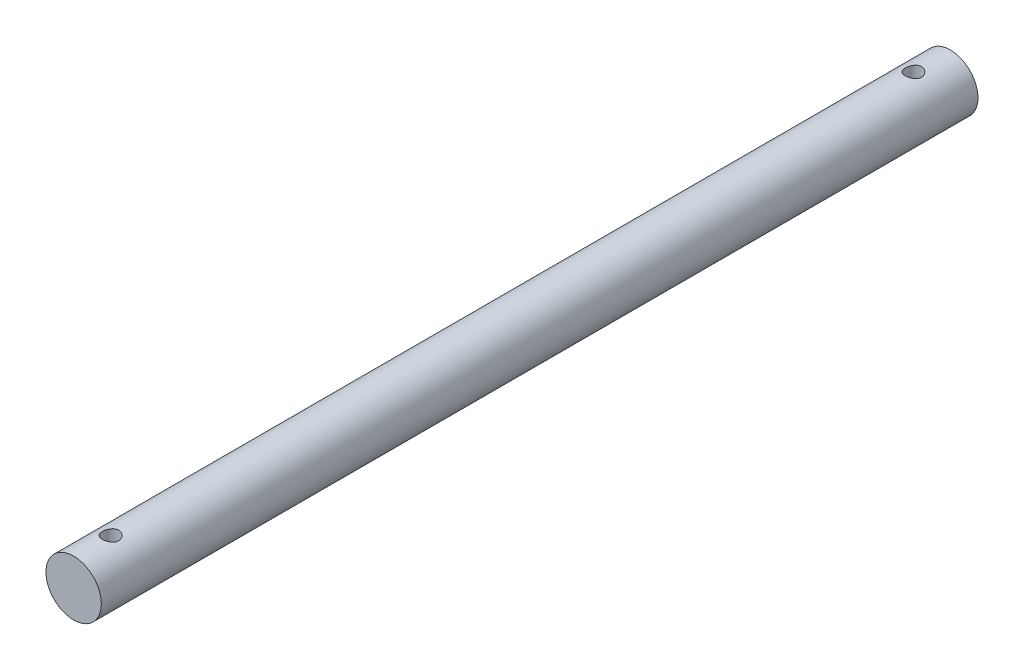
ISO-10303-21;
HEADER;
FILE_DESCRIPTION(('STEP AP214'),'2;1');
FILE_NAME('part.step','',(''),(''),'','','');
FILE_SCHEMA(('AUTOMOTIVE_DESIGN { 1 0 10303 214 1 1 1 1 }'));
ENDSEC;
DATA;
#1=APPLICATION_CONTEXT('core data for automotive mechanical design processes');
#2=APPLICATION_PROTOCOL_DEFINITION('international standard','automotive_design',2000,#1);
#3=PRODUCT_CONTEXT('',#1,'mechanical');
#4=PRODUCT('Part','Part','',(#3));
#5=PRODUCT_RELATED_PRODUCT_CATEGORY('part','',(#4));
#6=PRODUCT_DEFINITION_FORMATION('','',#4);
#7=PRODUCT_DEFINITION_CONTEXT('part definition',#1,'design');
#8=PRODUCT_DEFINITION('design','',#6,#7);
#9=PRODUCT_DEFINITION_SHAPE('','',#8);
#10=(LENGTH_UNIT() NAMED_UNIT(*) SI_UNIT(.MILLI.,.METRE.));
#11=(NAMED_UNIT(*) PLANE_ANGLE_UNIT() SI_UNIT($,.RADIAN.));
#12=(NAMED_UNIT(*) SI_UNIT($,.STERADIAN.) SOLID_ANGLE_UNIT());
#13=UNCERTAINTY_MEASURE_WITH_UNIT(LENGTH_MEASURE(1.E-05),#10,'distance_accuracy_value','');
#14=(GEOMETRIC_REPRESENTATION_CONTEXT(3) GLOBAL_UNCERTAINTY_ASSIGNED_CONTEXT((#13)) GLOBAL_UNIT_ASSIGNED_CONTEXT((#10,
#11,#12)) REPRESENTATION_CONTEXT('',''));
#15=CARTESIAN_POINT('',(0.,0.,0.));
#16=DIRECTION('',(0.,0.,1.));
#17=DIRECTION('',(1.,0.,0.));
#18=AXIS2_PLACEMENT_3D('',#15,#16,#17);
#19=CARTESIAN_POINT('',(0.,0.,190.));
#20=DIRECTION('',(0.,0.,-1.));
#21=DIRECTION('',(-1.,0.,0.));
#22=AXIS2_PLACEMENT_3D('',#19,#20,#21);
#23=CYLINDRICAL_SURFACE('',#22,6.);
#24=CARTESIAN_POINT('',(0.,-6.,9.75));
#25=CARTESIAN_POINT('',(0.0961253080181355,-5.99999897932778,9.74999851514796));
#26=CARTESIAN_POINT('',(0.192265738977876,-5.99766772555916,9.74205359001831));
#27=CARTESIAN_POINT('',(0.381754666118446,-5.9885952693758,9.71055420393173));
#28=CARTESIAN_POINT('',(0.475102186570465,-5.98185254415878,9.68699435279911));
#29=CARTESIAN_POINT('',(0.656244329270384,-5.96469737869574,9.62511299381745));
#30=CARTESIAN_POINT('',(0.744046672462425,-5.95429017982355,9.58681256248942));
#31=CARTESIAN_POINT('',(0.911982923632397,-5.93089244308038,9.49662155840011));
#32=CARTESIAN_POINT('',(0.992115936834367,-5.91790160432062,9.44472940253345));
#33=CARTESIAN_POINT('',(1.14462561886912,-5.89033024399658,9.32733498418698));
#34=CARTESIAN_POINT('',(1.21676335643119,-5.87571850769828,9.26152966416691));
#35=CARTESIAN_POINT('',(1.34915166645238,-5.84674198910841,9.11882327100677));
#36=CARTESIAN_POINT('',(1.40940036887666,-5.83237724599043,9.0419204556219));
#37=CARTESIAN_POINT('',(1.51753336674037,-5.80519383512121,8.87721033286065));
#38=CARTESIAN_POINT('',(1.56513041604445,-5.79241411758615,8.78920741823369));
#39=CARTESIAN_POINT('',(1.64475391362963,-5.7703123169837,8.60601392359827));
#40=CARTESIAN_POINT('',(1.67678387060038,-5.76098945488303,8.51082496885516));
#41=CARTESIAN_POINT('',(1.72351063083406,-5.74718144308774,8.31863537029766));
#42=CARTESIAN_POINT('',(1.73864609017391,-5.74257413524905,8.22175038253513));
#43=CARTESIAN_POINT('',(1.75252346344242,-5.73835505823415,8.0267152085859));
#44=CARTESIAN_POINT('',(1.75126910635539,-5.73874215273942,7.92856531526511));
#45=CARTESIAN_POINT('',(1.73274795276527,-5.74435959682319,7.73731524540825));
#46=CARTESIAN_POINT('',(1.71602568393069,-5.74942523520474,7.64415670470324));
#47=CARTESIAN_POINT('',(1.66792117497863,-5.76356324195848,7.46202918903925));
#48=CARTESIAN_POINT('',(1.63653755962284,-5.77263598619395,7.37306060796158));
#49=CARTESIAN_POINT('',(1.55958925270797,-5.79390080921967,7.20048400801911));
#50=CARTESIAN_POINT('',(1.51384428393233,-5.80613217077637,7.116961417586));
#51=CARTESIAN_POINT('',(1.40959719774949,-5.83231660479806,6.95859323240331));
#52=CARTESIAN_POINT('',(1.35109213587038,-5.84627007432716,6.8837496465045));
#53=CARTESIAN_POINT('',(1.22026040657199,-5.87499914138168,6.74176939696963));
#54=CARTESIAN_POINT('',(1.14748039837389,-5.88978548224527,6.67505196568478));
#55=CARTESIAN_POINT('',(0.9915813088856,-5.91802612754819,6.55467457984276));
#56=CARTESIAN_POINT('',(0.908461646345306,-5.93148035702561,6.50101535986281));
#57=CARTESIAN_POINT('',(0.733510271908772,-5.955652534232,6.40804165565273));
#58=CARTESIAN_POINT('',(0.641629012196374,-5.96635347926388,6.36881569218869));
#59=CARTESIAN_POINT('',(0.452189927913561,-5.98369087780733,6.30649482914881));
#60=CARTESIAN_POINT('',(0.354633604003034,-5.99032840050988,6.28339568596673));
#61=CARTESIAN_POINT('',(0.160181198028379,-5.99862388766847,6.25467172956898));
#62=CARTESIAN_POINT('',(0.0633758944645877,-6.00044382600874,6.24847829102018));
#63=CARTESIAN_POINT('',(-0.129894955210873,-5.99937180655025,6.25215387818972));
#64=CARTESIAN_POINT('',(-0.226360542441065,-5.99648044012062,6.26202088797948));
#65=CARTESIAN_POINT('',(-0.414097830664113,-5.98641640064662,6.29707558682437));
#66=CARTESIAN_POINT('',(-0.505436223327998,-5.97933553979801,6.32193493989793));
#67=CARTESIAN_POINT('',(-0.682629103921201,-5.96170716095043,6.38587721933104));
#68=CARTESIAN_POINT('',(-0.768482945307058,-5.95115923513568,6.42496181900248));
#69=CARTESIAN_POINT('',(-0.934392573124852,-5.92740206937566,6.51722533792297));
#70=CARTESIAN_POINT('',(-1.01427661269997,-5.91413878305625,6.57069881094937));
#71=CARTESIAN_POINT('',(-1.16413296084878,-5.8864769523799,6.68986114921517));
#72=CARTESIAN_POINT('',(-1.23410291257553,-5.87207813933966,6.75555291051717));
#73=CARTESIAN_POINT('',(-1.36462158583737,-5.84315282434342,6.89995535038969));
#74=CARTESIAN_POINT('',(-1.424766422283,-5.82863878716344,6.97903434380823));
#75=CARTESIAN_POINT('',(-1.5309555158763,-5.80165389300297,7.14647697273483));
#76=CARTESIAN_POINT('',(-1.57700021873977,-5.78918297144387,7.23484031463907));
#77=CARTESIAN_POINT('',(-1.65335355571835,-5.76784149110914,7.41800906834096));
#78=CARTESIAN_POINT('',(-1.68374186549711,-5.75895275395434,7.51277902915982));
#79=CARTESIAN_POINT('',(-1.72804822085091,-5.74581531845761,7.70639550313222));
#80=CARTESIAN_POINT('',(-1.74197152209896,-5.7415651395094,7.80524070502689));
#81=CARTESIAN_POINT('',(-1.75260895170656,-5.73832630544296,8.0000225411818));
#82=CARTESIAN_POINT('',(-1.74997891215048,-5.73913712613566,8.09592050986434));
#83=CARTESIAN_POINT('',(-1.72913831847244,-5.74545008197209,8.28584289285404));
#84=CARTESIAN_POINT('',(-1.7109283259395,-5.75095204802057,8.37986737456719));
#85=CARTESIAN_POINT('',(-1.65985748033916,-5.76589662443703,8.56236618301317));
#86=CARTESIAN_POINT('',(-1.62716125079618,-5.77529488178541,8.6508904754052));
#87=CARTESIAN_POINT('',(-1.54817363617336,-5.79696714255006,8.82126724612185));
#88=CARTESIAN_POINT('',(-1.50187976224371,-5.80924167234268,8.9031184995373));
#89=CARTESIAN_POINT('',(-1.39513128146528,-5.83581435741765,9.06089207023767));
#90=CARTESIAN_POINT('',(-1.33424162455882,-5.85016789019055,9.13651071754182));
#91=CARTESIAN_POINT('',(-1.20082452655383,-5.87900256664697,9.27666967580499));
#92=CARTESIAN_POINT('',(-1.12829412203371,-5.89348374193531,9.34120715711446));
#93=CARTESIAN_POINT('',(-0.971285174602811,-5.92141239923087,9.45910953147708));
#94=CARTESIAN_POINT('',(-0.886536063614253,-5.93482122382387,9.51212417615002));
#95=CARTESIAN_POINT('',(-0.708936452074231,-5.95864200095583,9.60307524955485));
#96=CARTESIAN_POINT('',(-0.61609014933606,-5.96905549446415,9.64101943523146));
#97=CARTESIAN_POINT('',(-0.436605177870392,-5.98468728404806,9.69694094930792));
#98=CARTESIAN_POINT('',(-0.35058619705069,-5.99038360588642,9.71678627055829));
#99=CARTESIAN_POINT('',(-0.176382174555847,-5.99804015775584,9.74331551061332));
#100=CARTESIAN_POINT('',(-0.0881974529296947,-6.00000093649312,9.7500013623901));
#101=CARTESIAN_POINT('',(0.,-6.,9.75));
#102=B_SPLINE_CURVE_WITH_KNOTS('',3,(#24,#25,#26,#27,#28,#29,#30,#31,#32,#33,#34,#35,#36,#37,
#38,#39,#40,#41,#42,#43,#44,#45,#46,#47,#48,#49,#50,#51,#52,#53,#54,#55,#56,#57,#58,#59,#60,#61,
#62,#63,#64,#65,#66,#67,#68,#69,#70,#71,#72,#73,#74,#75,#76,#77,#78,#79,#80,#81,#82,#83,#84,#85,
#86,#87,#88,#89,#90,#91,#92,#93,#94,#95,#96,#97,#98,#99,#100,#101),.UNSPECIFIED.,.T.,.F.,(4,2,2,
2,2,2,2,2,2,2,2,2,2,2,2,2,2,2,2,2,2,2,2,2,2,2,2,2,2,2,2,2,2,2,2,2,2,2,4),(0.,0.288052093618849,
0.576203672859808,0.863944765925738,1.15171938874705,1.4465642107671,1.74145537223885,
2.04255951405361,2.34359575805744,2.63661948180926,2.92957653844227,3.21259753810652,
3.49564509054993,3.78239825352144,4.06921765673404,4.36732499534254,4.6654490998204,
4.96537230276013,5.26521655422946,5.55484346037066,5.84443401496554,6.12790175562713,
6.41140285130437,6.70121883369904,6.99110359801335,7.29089914342066,7.59068521108749,
7.88893020644378,8.18707997551211,8.4734936601924,8.75989702134952,9.04312596000905,
9.32640677192025,9.61950228446207,9.9126725299444,10.2137891731667,10.5147506265853,
10.779084693066,11.0433799290662),.UNSPECIFIED.);
#103=CARTESIAN_POINT('',(0.,-6.,9.75));
#104=VERTEX_POINT('',#103);
#105=EDGE_CURVE('E10',#104,#104,#102,.T.);
#106=ORIENTED_EDGE('',*,*,#105,.T.);
#107=EDGE_LOOP('',(#106));
#108=FACE_BOUND('',#107,.T.);
#109=CARTESIAN_POINT('',(0.,6.,9.75));
#110=CARTESIAN_POINT('',(-0.0961253080181355,5.99999897932778,9.74999851514796));
#111=CARTESIAN_POINT('',(-0.192265738977876,5.99766772555916,9.74205359001831));
#112=CARTESIAN_POINT('',(-0.381754666118446,5.9885952693758,9.71055420393173));
#113=CARTESIAN_POINT('',(-0.475102186570466,5.98185254415878,9.68699435279911));
#114=CARTESIAN_POINT('',(-0.656244329270384,5.96469737869574,9.62511299381745));
#115=CARTESIAN_POINT('',(-0.744046672462426,5.95429017982355,9.58681256248942));
#116=CARTESIAN_POINT('',(-0.911982923632398,5.93089244308038,9.49662155840011));
#117=CARTESIAN_POINT('',(-0.992115936834368,5.91790160432062,9.44472940253345));
#118=CARTESIAN_POINT('',(-1.14462561886912,5.89033024399658,9.32733498418698));
#119=CARTESIAN_POINT('',(-1.21676335643119,5.87571850769828,9.26152966416691));
#120=CARTESIAN_POINT('',(-1.34915166645238,5.84674198910841,9.11882327100677));
#121=CARTESIAN_POINT('',(-1.40940036887666,5.83237724599043,9.0419204556219));
#122=CARTESIAN_POINT('',(-1.51753336674038,5.80519383512121,8.87721033286065));
#123=CARTESIAN_POINT('',(-1.56513041604445,5.79241411758615,8.78920741823369));
#124=CARTESIAN_POINT('',(-1.64475391362963,5.7703123169837,8.60601392359827));
#125=CARTESIAN_POINT('',(-1.67678387060038,5.76098945488303,8.51082496885516));
#126=CARTESIAN_POINT('',(-1.72351063083406,5.74718144308774,8.31863537029766));
#127=CARTESIAN_POINT('',(-1.73864609017391,5.74257413524905,8.22175038253513));
#128=CARTESIAN_POINT('',(-1.75252346344242,5.73835505823415,8.0267152085859));
#129=CARTESIAN_POINT('',(-1.75126910635539,5.73874215273942,7.92856531526511));
#130=CARTESIAN_POINT('',(-1.73274795276527,5.74435959682319,7.73731524540825));
#131=CARTESIAN_POINT('',(-1.71602568393069,5.74942523520474,7.64415670470324));
#132=CARTESIAN_POINT('',(-1.66792117497863,5.76356324195848,7.46202918903925));
#133=CARTESIAN_POINT('',(-1.63653755962284,5.77263598619395,7.37306060796158));
#134=CARTESIAN_POINT('',(-1.55958925270797,5.79390080921967,7.20048400801911));
#135=CARTESIAN_POINT('',(-1.51384428393233,5.80613217077637,7.116961417586));
#136=CARTESIAN_POINT('',(-1.40959719774949,5.83231660479806,6.95859323240331));
#137=CARTESIAN_POINT('',(-1.35109213587038,5.84627007432716,6.8837496465045));
#138=CARTESIAN_POINT('',(-1.22026040657199,5.87499914138168,6.74176939696963));
#139=CARTESIAN_POINT('',(-1.14748039837389,5.88978548224527,6.67505196568478));
#140=CARTESIAN_POINT('',(-0.9915813088856,5.91802612754819,6.55467457984276));
#141=CARTESIAN_POINT('',(-0.908461646345306,5.93148035702561,6.50101535986281));
#142=CARTESIAN_POINT('',(-0.733510271908772,5.955652534232,6.40804165565273));
#143=CARTESIAN_POINT('',(-0.641629012196374,5.96635347926388,6.36881569218869));
#144=CARTESIAN_POINT('',(-0.452189927913562,5.98369087780733,6.30649482914881));
#145=CARTESIAN_POINT('',(-0.354633604003035,5.99032840050988,6.28339568596673));
#146=CARTESIAN_POINT('',(-0.160181198028379,5.99862388766847,6.25467172956898));
#147=CARTESIAN_POINT('',(-0.0633758944645879,6.00044382600874,6.24847829102018));
#148=CARTESIAN_POINT('',(0.129894955210873,5.99937180655025,6.25215387818972));
#149=CARTESIAN_POINT('',(0.226360542441065,5.99648044012062,6.26202088797948));
#150=CARTESIAN_POINT('',(0.414097830664112,5.98641640064662,6.29707558682437));
#151=CARTESIAN_POINT('',(0.505436223327997,5.97933553979801,6.32193493989793));
#152=CARTESIAN_POINT('',(0.682629103921201,5.96170716095043,6.38587721933104));
#153=CARTESIAN_POINT('',(0.768482945307058,5.95115923513568,6.42496181900248));
#154=CARTESIAN_POINT('',(0.934392573124852,5.92740206937566,6.51722533792297));
#155=CARTESIAN_POINT('',(1.01427661269997,5.91413878305625,6.57069881094937));
#156=CARTESIAN_POINT('',(1.16413296084878,5.8864769523799,6.68986114921517));
#157=CARTESIAN_POINT('',(1.23410291257553,5.87207813933966,6.75555291051717));
#158=CARTESIAN_POINT('',(1.36462158583737,5.84315282434342,6.89995535038969));
#159=CARTESIAN_POINT('',(1.42476642228299,5.82863878716344,6.97903434380822));
#160=CARTESIAN_POINT('',(1.5309555158763,5.80165389300297,7.14647697273483));
#161=CARTESIAN_POINT('',(1.57700021873977,5.78918297144387,7.23484031463907));
#162=CARTESIAN_POINT('',(1.65335355571835,5.76784149110914,7.41800906834096));
#163=CARTESIAN_POINT('',(1.68374186549711,5.75895275395434,7.51277902915982));
#164=CARTESIAN_POINT('',(1.72804822085091,5.74581531845761,7.70639550313222));
#165=CARTESIAN_POINT('',(1.74197152209896,5.7415651395094,7.80524070502689));
#166=CARTESIAN_POINT('',(1.75260895170656,5.73832630544296,8.0000225411818));
#167=CARTESIAN_POINT('',(1.74997891215048,5.73913712613566,8.09592050986434));
#168=CARTESIAN_POINT('',(1.72913831847244,5.74545008197209,8.28584289285404));
#169=CARTESIAN_POINT('',(1.7109283259395,5.75095204802057,8.37986737456719));
#170=CARTESIAN_POINT('',(1.65985748033916,5.76589662443703,8.56236618301317));
#171=CARTESIAN_POINT('',(1.62716125079618,5.77529488178541,8.6508904754052));
#172=CARTESIAN_POINT('',(1.54817363617336,5.79696714255006,8.82126724612185));
#173=CARTESIAN_POINT('',(1.50187976224371,5.80924167234268,8.9031184995373));
#174=CARTESIAN_POINT('',(1.39513128146528,5.83581435741765,9.06089207023767));
#175=CARTESIAN_POINT('',(1.33424162455883,5.85016789019055,9.13651071754182));
#176=CARTESIAN_POINT('',(1.20082452655383,5.87900256664697,9.27666967580499));
#177=CARTESIAN_POINT('',(1.12829412203371,5.89348374193531,9.34120715711446));
#178=CARTESIAN_POINT('',(0.971285174602811,5.92141239923087,9.45910953147708));
#179=CARTESIAN_POINT('',(0.886536063614254,5.93482122382387,9.51212417615002));
#180=CARTESIAN_POINT('',(0.708936452074232,5.95864200095583,9.60307524955484));
#181=CARTESIAN_POINT('',(0.616090149336061,5.96905549446415,9.64101943523146));
#182=CARTESIAN_POINT('',(0.436605177870392,5.98468728404806,9.69694094930792));
#183=CARTESIAN_POINT('',(0.350586197050688,5.99038360588642,9.71678627055829));
#184=CARTESIAN_POINT('',(0.176382174555846,5.99804015775584,9.74331551061332));
#185=CARTESIAN_POINT('',(0.088197452929694,6.00000093649312,9.7500013623901));
#186=CARTESIAN_POINT('',(0.,6.,9.75));
#187=B_SPLINE_CURVE_WITH_KNOTS('',3,(#109,#110,#111,#112,#113,#114,#115,#116,#117,#118,#119,
#120,#121,#122,#123,#124,#125,#126,#127,#128,#129,#130,#131,#132,#133,#134,#135,#136,#137,#138,
#139,#140,#141,#142,#143,#144,#145,#146,#147,#148,#149,#150,#151,#152,#153,#154,#155,#156,#157,
#158,#159,#160,#161,#162,#163,#164,#165,#166,#167,#168,#169,#170,#171,#172,#173,#174,#175,#176,
#177,#178,#179,#180,#181,#182,#183,#184,#185,#186),.UNSPECIFIED.,.T.,.F.,(4,2,2,2,2,2,2,2,2,2,2,
2,2,2,2,2,2,2,2,2,2,2,2,2,2,2,2,2,2,2,2,2,2,2,2,2,2,2,4),(0.,0.288052093618849,
0.576203672859809,0.863944765925738,1.15171938874705,1.4465642107671,1.74145537223885,
2.04255951405361,2.34359575805744,2.63661948180926,2.92957653844227,3.21259753810652,
3.49564509054993,3.78239825352144,4.06921765673404,4.36732499534254,4.6654490998204,
4.96537230276013,5.26521655422946,5.55484346037066,5.84443401496554,6.12790175562713,
6.41140285130437,6.70121883369904,6.99110359801335,7.29089914342065,7.59068521108749,
7.88893020644378,8.1870799755121,8.4734936601924,8.75989702134952,9.04312596000905,
9.32640677192025,9.61950228446207,9.9126725299444,10.2137891731667,10.5147506265853,
10.779084693066,11.0433799290662),.UNSPECIFIED.);
#188=CARTESIAN_POINT('',(0.,6.,9.75));
#189=VERTEX_POINT('',#188);
#190=EDGE_CURVE('E41',#189,#189,#187,.T.);
#191=ORIENTED_EDGE('',*,*,#190,.T.);
#192=EDGE_LOOP('',(#191));
#193=FACE_BOUND('',#192,.T.);
#194=CARTESIAN_POINT('',(0.,-6.,183.75));
#195=CARTESIAN_POINT('',(0.0961253080181344,-5.99999897932778,183.749998515148));
#196=CARTESIAN_POINT('',(0.192265738977874,-5.99766772555916,183.742053590018));
#197=CARTESIAN_POINT('',(0.381754666118445,-5.9885952693758,183.710554203932));
#198=CARTESIAN_POINT('',(0.475102186570466,-5.98185254415878,183.686994352799));
#199=CARTESIAN_POINT('',(0.656244329270384,-5.96469737869574,183.625112993817));
#200=CARTESIAN_POINT('',(0.744046672462424,-5.95429017982356,183.586812562489));
#201=CARTESIAN_POINT('',(0.911982923632397,-5.93089244308038,183.4966215584));
#202=CARTESIAN_POINT('',(0.992115936834369,-5.91790160432062,183.444729402533));
#203=CARTESIAN_POINT('',(1.14462561886912,-5.89033024399658,183.327334984187));
#204=CARTESIAN_POINT('',(1.21676335643119,-5.87571850769828,183.261529664167));
#205=CARTESIAN_POINT('',(1.34915166645238,-5.84674198910841,183.118823271007));
#206=CARTESIAN_POINT('',(1.40940036887666,-5.83237724599043,183.041920455622));
#207=CARTESIAN_POINT('',(1.51753336674037,-5.80519383512122,182.877210332861));
#208=CARTESIAN_POINT('',(1.56513041604443,-5.79241411758616,182.789207418234));
#209=CARTESIAN_POINT('',(1.64475391362963,-5.7703123169837,182.606013923598));
#210=CARTESIAN_POINT('',(1.67678387060038,-5.76098945488303,182.510824968855));
#211=CARTESIAN_POINT('',(1.72351063083406,-5.74718144308774,182.318635370298));
#212=CARTESIAN_POINT('',(1.73864609017392,-5.74257413524905,182.221750382535));
#213=CARTESIAN_POINT('',(1.75252346344242,-5.73835505823415,182.026715208586));
#214=CARTESIAN_POINT('',(1.75126910635539,-5.73874215273942,181.928565315265));
#215=CARTESIAN_POINT('',(1.73274795276527,-5.74435959682319,181.737315245408));
#216=CARTESIAN_POINT('',(1.7160256839307,-5.74942523520474,181.644156704703));
#217=CARTESIAN_POINT('',(1.66792117497864,-5.76356324195848,181.462029189039));
#218=CARTESIAN_POINT('',(1.63653755962284,-5.77263598619394,181.373060607962));
#219=CARTESIAN_POINT('',(1.55958925270797,-5.79390080921967,181.200484008019));
#220=CARTESIAN_POINT('',(1.51384428393234,-5.80613217077637,181.116961417586));
#221=CARTESIAN_POINT('',(1.40959719774949,-5.83231660479806,180.958593232403));
#222=CARTESIAN_POINT('',(1.35109213587037,-5.84627007432716,180.883749646504));
#223=CARTESIAN_POINT('',(1.22026040657198,-5.87499914138168,180.74176939697));
#224=CARTESIAN_POINT('',(1.14748039837388,-5.88978548224528,180.675051965685));
#225=CARTESIAN_POINT('',(0.991581308885597,-5.91802612754819,180.554674579843));
#226=CARTESIAN_POINT('',(0.908461646345304,-5.93148035702561,180.501015359863));
#227=CARTESIAN_POINT('',(0.733510271908771,-5.955652534232,180.408041655653));
#228=CARTESIAN_POINT('',(0.641629012196372,-5.96635347926388,180.368815692189));
#229=CARTESIAN_POINT('',(0.452189927913558,-5.98369087780734,180.306494829149));
#230=CARTESIAN_POINT('',(0.354633604003031,-5.99032840050988,180.283395685967));
#231=CARTESIAN_POINT('',(0.160181198028375,-5.99862388766847,180.254671729569));
#232=CARTESIAN_POINT('',(0.0633758944645845,-6.00044382600874,180.24847829102));
#233=CARTESIAN_POINT('',(-0.129894955210874,-5.99937180655025,180.25215387819));
#234=CARTESIAN_POINT('',(-0.226360542441065,-5.99648044012062,180.26202088798));
#235=CARTESIAN_POINT('',(-0.414097830664113,-5.98641640064662,180.297075586824));
#236=CARTESIAN_POINT('',(-0.505436223327999,-5.97933553979801,180.321934939898));
#237=CARTESIAN_POINT('',(-0.682629103921203,-5.96170716095043,180.385877219331));
#238=CARTESIAN_POINT('',(-0.76848294530706,-5.95115923513568,180.424961819002));
#239=CARTESIAN_POINT('',(-0.934392573124854,-5.92740206937566,180.517225337923));
#240=CARTESIAN_POINT('',(-1.01427661269997,-5.91413878305625,180.570698810949));
#241=CARTESIAN_POINT('',(-1.16413296084878,-5.8864769523799,180.689861149215));
#242=CARTESIAN_POINT('',(-1.23410291257553,-5.87207813933966,180.755552910517));
#243=CARTESIAN_POINT('',(-1.36462158583736,-5.84315282434343,180.89995535039));
#244=CARTESIAN_POINT('',(-1.42476642228299,-5.82863878716344,180.979034343808));
#245=CARTESIAN_POINT('',(-1.5309555158763,-5.80165389300297,181.146476972735));
#246=CARTESIAN_POINT('',(-1.57700021873977,-5.78918297144387,181.234840314639));
#247=CARTESIAN_POINT('',(-1.65335355571835,-5.76784149110914,181.418009068341));
#248=CARTESIAN_POINT('',(-1.68374186549711,-5.75895275395434,181.51277902916));
#249=CARTESIAN_POINT('',(-1.72804822085091,-5.74581531845761,181.706395503132));
#250=CARTESIAN_POINT('',(-1.74197152209896,-5.7415651395094,181.805240705027));
#251=CARTESIAN_POINT('',(-1.75260895170656,-5.73832630544296,182.000022541182));
#252=CARTESIAN_POINT('',(-1.74997891215049,-5.73913712613566,182.095920509864));
#253=CARTESIAN_POINT('',(-1.72913831847244,-5.74545008197209,182.285842892854));
#254=CARTESIAN_POINT('',(-1.7109283259395,-5.75095204802057,182.379867374567));
#255=CARTESIAN_POINT('',(-1.65985748033917,-5.76589662443703,182.562366183013));
#256=CARTESIAN_POINT('',(-1.62716125079619,-5.77529488178541,182.650890475405));
#257=CARTESIAN_POINT('',(-1.54817363617336,-5.79696714255006,182.821267246122));
#258=CARTESIAN_POINT('',(-1.5018797622437,-5.80924167234268,182.903118499537));
#259=CARTESIAN_POINT('',(-1.39513128146527,-5.83581435741766,183.060892070238));
#260=CARTESIAN_POINT('',(-1.33424162455882,-5.85016789019055,183.136510717542));
#261=CARTESIAN_POINT('',(-1.20082452655382,-5.87900256664698,183.276669675805));
#262=CARTESIAN_POINT('',(-1.1282941220337,-5.89348374193531,183.341207157114));
#263=CARTESIAN_POINT('',(-0.971285174602807,-5.92141239923087,183.459109531477));
#264=CARTESIAN_POINT('',(-0.88653606361425,-5.93482122382387,183.51212417615));
#265=CARTESIAN_POINT('',(-0.708936452074232,-5.95864200095583,183.603075249555));
#266=CARTESIAN_POINT('',(-0.616090149336066,-5.96905549446415,183.641019435231));
#267=CARTESIAN_POINT('',(-0.4366051778704,-5.98468728404806,183.696940949308));
#268=CARTESIAN_POINT('',(-0.350586197050694,-5.99038360588642,183.716786270558));
#269=CARTESIAN_POINT('',(-0.176382174555849,-5.99804015775584,183.743315510613));
#270=CARTESIAN_POINT('',(-0.0881974529296957,-6.00000093649312,183.75000136239));
#271=CARTESIAN_POINT('',(0.,-6.,183.75));
#272=B_SPLINE_CURVE_WITH_KNOTS('',3,(#194,#195,#196,#197,#198,#199,#200,#201,#202,#203,#204,
#205,#206,#207,#208,#209,#210,#211,#212,#213,#214,#215,#216,#217,#218,#219,#220,#221,#222,#223,
#224,#225,#226,#227,#228,#229,#230,#231,#232,#233,#234,#235,#236,#237,#238,#239,#240,#241,#242,
#243,#244,#245,#246,#247,#248,#249,#250,#251,#252,#253,#254,#255,#256,#257,#258,#259,#260,#261,
#262,#263,#264,#265,#266,#267,#268,#269,#270,#271),.UNSPECIFIED.,.T.,.F.,(4,2,2,2,2,2,2,2,2,2,2,
2,2,2,2,2,2,2,2,2,2,2,2,2,2,2,2,2,2,2,2,2,2,2,2,2,2,2,4),(0.,0.288052093618845,0.57620367285981,
0.86394476592574,1.15171938874706,1.4465642107671,1.74145537223884,2.04255951405357,
2.34359575805745,2.63661948180929,2.92957653844229,3.2125975381065,3.49564509054992,
3.78239825352143,4.06921765673405,4.36732499534254,4.6654490998204,4.96537230276013,
5.26521655422947,5.55484346037067,5.84443401496554,6.12790175562713,6.41140285130438,
6.70121883369904,6.99110359801336,7.29089914342065,7.59068521108749,7.88893020644379,
8.18707997551212,8.4734936601924,8.75989702134951,9.04312596000909,9.32640677192028,
9.61950228446208,9.91267252994443,10.2137891731667,10.5147506265854,10.779084693066,
11.0433799290662),.UNSPECIFIED.);
#273=CARTESIAN_POINT('',(0.,-6.,183.75));
#274=VERTEX_POINT('',#273);
#275=EDGE_CURVE('E45',#274,#274,#272,.T.);
#276=ORIENTED_EDGE('',*,*,#275,.T.);
#277=EDGE_LOOP('',(#276));
#278=FACE_BOUND('',#277,.T.);
#279=CARTESIAN_POINT('',(0.,6.,183.75));
#280=CARTESIAN_POINT('',(-0.0961253080181345,5.99999897932778,183.749998515148));
#281=CARTESIAN_POINT('',(-0.192265738977874,5.99766772555916,183.742053590018));
#282=CARTESIAN_POINT('',(-0.381754666118445,5.9885952693758,183.710554203932));
#283=CARTESIAN_POINT('',(-0.475102186570466,5.98185254415878,183.686994352799));
#284=CARTESIAN_POINT('',(-0.656244329270384,5.96469737869574,183.625112993817));
#285=CARTESIAN_POINT('',(-0.744046672462425,5.95429017982356,183.586812562489));
#286=CARTESIAN_POINT('',(-0.911982923632397,5.93089244308038,183.4966215584));
#287=CARTESIAN_POINT('',(-0.992115936834368,5.91790160432062,183.444729402533));
#288=CARTESIAN_POINT('',(-1.14462561886912,5.89033024399658,183.327334984187));
#289=CARTESIAN_POINT('',(-1.21676335643118,5.87571850769828,183.261529664167));
#290=CARTESIAN_POINT('',(-1.34915166645237,5.84674198910841,183.118823271007));
#291=CARTESIAN_POINT('',(-1.40940036887665,5.83237724599043,183.041920455622));
#292=CARTESIAN_POINT('',(-1.51753336674037,5.80519383512121,182.877210332861));
#293=CARTESIAN_POINT('',(-1.56513041604445,5.79241411758615,182.789207418234));
#294=CARTESIAN_POINT('',(-1.64475391362964,5.7703123169837,182.606013923598));
#295=CARTESIAN_POINT('',(-1.67678387060039,5.76098945488303,182.510824968855));
#296=CARTESIAN_POINT('',(-1.72351063083406,5.74718144308774,182.318635370298));
#297=CARTESIAN_POINT('',(-1.73864609017392,5.74257413524905,182.221750382535));
#298=CARTESIAN_POINT('',(-1.75252346344242,5.73835505823415,182.026715208586));
#299=CARTESIAN_POINT('',(-1.75126910635539,5.73874215273942,181.928565315265));
#300=CARTESIAN_POINT('',(-1.73274795276527,5.74435959682319,181.737315245408));
#301=CARTESIAN_POINT('',(-1.7160256839307,5.74942523520474,181.644156704703));
#302=CARTESIAN_POINT('',(-1.66792117497864,5.76356324195848,181.462029189039));
#303=CARTESIAN_POINT('',(-1.63653755962284,5.77263598619394,181.373060607962));
#304=CARTESIAN_POINT('',(-1.55958925270797,5.79390080921967,181.200484008019));
#305=CARTESIAN_POINT('',(-1.51384428393234,5.80613217077637,181.116961417586));
#306=CARTESIAN_POINT('',(-1.40959719774949,5.83231660479806,180.958593232403));
#307=CARTESIAN_POINT('',(-1.35109213587037,5.84627007432716,180.883749646504));
#308=CARTESIAN_POINT('',(-1.22026040657198,5.87499914138168,180.74176939697));
#309=CARTESIAN_POINT('',(-1.14748039837388,5.88978548224528,180.675051965685));
#310=CARTESIAN_POINT('',(-0.991581308885597,5.91802612754819,180.554674579843));
#311=CARTESIAN_POINT('',(-0.908461646345304,5.93148035702561,180.501015359863));
#312=CARTESIAN_POINT('',(-0.733510271908771,5.955652534232,180.408041655653));
#313=CARTESIAN_POINT('',(-0.641629012196372,5.96635347926388,180.368815692189));
#314=CARTESIAN_POINT('',(-0.452189927913558,5.98369087780734,180.306494829149));
#315=CARTESIAN_POINT('',(-0.35463360400303,5.99032840050988,180.283395685967));
#316=CARTESIAN_POINT('',(-0.160181198028374,5.99862388766847,180.254671729569));
#317=CARTESIAN_POINT('',(-0.0633758944645838,6.00044382600874,180.24847829102));
#318=CARTESIAN_POINT('',(0.129894955210875,5.99937180655025,180.25215387819));
#319=CARTESIAN_POINT('',(0.226360542441066,5.99648044012062,180.26202088798));
#320=CARTESIAN_POINT('',(0.414097830664114,5.98641640064662,180.297075586824));
#321=CARTESIAN_POINT('',(0.505436223328,5.97933553979801,180.321934939898));
#322=CARTESIAN_POINT('',(0.682629103921204,5.96170716095043,180.385877219331));
#323=CARTESIAN_POINT('',(0.768482945307061,5.95115923513568,180.424961819002));
#324=CARTESIAN_POINT('',(0.934392573124855,5.92740206937566,180.517225337923));
#325=CARTESIAN_POINT('',(1.01427661269997,5.91413878305625,180.570698810949));
#326=CARTESIAN_POINT('',(1.16413296084878,5.8864769523799,180.689861149215));
#327=CARTESIAN_POINT('',(1.23410291257553,5.87207813933966,180.755552910517));
#328=CARTESIAN_POINT('',(1.36462158583737,5.84315282434343,180.89995535039));
#329=CARTESIAN_POINT('',(1.42476642228299,5.82863878716344,180.979034343808));
#330=CARTESIAN_POINT('',(1.5309555158763,5.80165389300297,181.146476972735));
#331=CARTESIAN_POINT('',(1.57700021873977,5.78918297144387,181.234840314639));
#332=CARTESIAN_POINT('',(1.65335355571835,5.76784149110914,181.418009068341));
#333=CARTESIAN_POINT('',(1.68374186549711,5.75895275395434,181.51277902916));
#334=CARTESIAN_POINT('',(1.72804822085091,5.74581531845761,181.706395503132));
#335=CARTESIAN_POINT('',(1.74197152209896,5.7415651395094,181.805240705027));
#336=CARTESIAN_POINT('',(1.75260895170656,5.73832630544296,182.000022541182));
#337=CARTESIAN_POINT('',(1.74997891215049,5.73913712613566,182.095920509864));
#338=CARTESIAN_POINT('',(1.72913831847244,5.74545008197209,182.285842892854));
#339=CARTESIAN_POINT('',(1.7109283259395,5.75095204802057,182.379867374567));
#340=CARTESIAN_POINT('',(1.65985748033917,5.76589662443703,182.562366183013));
#341=CARTESIAN_POINT('',(1.62716125079619,5.77529488178541,182.650890475405));
#342=CARTESIAN_POINT('',(1.54817363617336,5.79696714255006,182.821267246122));
#343=CARTESIAN_POINT('',(1.5018797622437,5.80924167234268,182.903118499537));
#344=CARTESIAN_POINT('',(1.39513128146527,5.83581435741766,183.060892070238));
#345=CARTESIAN_POINT('',(1.33424162455882,5.85016789019055,183.136510717542));
#346=CARTESIAN_POINT('',(1.20082452655382,5.87900256664697,183.276669675805));
#347=CARTESIAN_POINT('',(1.1282941220337,5.89348374193531,183.341207157114));
#348=CARTESIAN_POINT('',(0.971285174602806,5.92141239923087,183.459109531477));
#349=CARTESIAN_POINT('',(0.886536063614247,5.93482122382387,183.51212417615));
#350=CARTESIAN_POINT('',(0.708936452074225,5.95864200095583,183.603075249555));
#351=CARTESIAN_POINT('',(0.616090149336056,5.96905549446415,183.641019435231));
#352=CARTESIAN_POINT('',(0.43660517787039,5.98468728404806,183.696940949308));
#353=CARTESIAN_POINT('',(0.350586197050686,5.99038360588642,183.716786270558));
#354=CARTESIAN_POINT('',(0.176382174555845,5.99804015775584,183.743315510613));
#355=CARTESIAN_POINT('',(0.0881974529296937,6.00000093649312,183.75000136239));
#356=CARTESIAN_POINT('',(0.,6.,183.75));
#357=B_SPLINE_CURVE_WITH_KNOTS('',3,(#279,#280,#281,#282,#283,#284,#285,#286,#287,#288,#289,
#290,#291,#292,#293,#294,#295,#296,#297,#298,#299,#300,#301,#302,#303,#304,#305,#306,#307,#308,
#309,#310,#311,#312,#313,#314,#315,#316,#317,#318,#319,#320,#321,#322,#323,#324,#325,#326,#327,
#328,#329,#330,#331,#332,#333,#334,#335,#336,#337,#338,#339,#340,#341,#342,#343,#344,#345,#346,
#347,#348,#349,#350,#351,#352,#353,#354,#355,#356),.UNSPECIFIED.,.T.,.F.,(4,2,2,2,2,2,2,2,2,2,2,
2,2,2,2,2,2,2,2,2,2,2,2,2,2,2,2,2,2,2,2,2,2,2,2,2,2,2,4),(0.,0.288052093618845,
0.576203672859811,0.863944765925741,1.15171938874706,1.44656421076707,1.74145537223884,
2.04255951405361,2.34359575805745,2.63661948180929,2.9295765384423,3.2125975381065,
3.49564509054992,3.78239825352143,4.06921765673406,4.36732499534255,4.66544909982041,
4.96537230276014,5.26521655422947,5.55484346037067,5.84443401496555,6.12790175562713,
6.41140285130438,6.70121883369904,6.99110359801336,7.29089914342065,7.59068521108749,
7.8889302064438,8.18707997551212,8.47349366019241,8.75989702134952,9.04312596000909,
9.32640677192028,9.61950228446208,9.91267252994443,10.2137891731667,10.5147506265854,
10.779084693066,11.0433799290662),.UNSPECIFIED.);
#358=CARTESIAN_POINT('',(0.,6.,183.75));
#359=VERTEX_POINT('',#358);
#360=EDGE_CURVE('E49',#359,#359,#357,.T.);
#361=ORIENTED_EDGE('',*,*,#360,.T.);
#362=EDGE_LOOP('',(#361));
#363=FACE_BOUND('',#362,.T.);
#364=CARTESIAN_POINT('',(0.,0.,190.));
#365=DIRECTION('',(0.,0.,1.));
#366=DIRECTION('',(1.,0.,0.));
#367=AXIS2_PLACEMENT_3D('',#364,#365,#366);
#368=CIRCLE('',#367,6.);
#369=CARTESIAN_POINT('',(6.,0.,190.));
#370=VERTEX_POINT('',#369);
#371=EDGE_CURVE('E77',#370,#370,#368,.T.);
#372=ORIENTED_EDGE('',*,*,#371,.F.);
#373=EDGE_LOOP('',(#372));
#374=FACE_BOUND('',#373,.T.);
#375=CARTESIAN_POINT('',(0.,0.,0.));
#376=DIRECTION('',(0.,0.,1.));
#377=DIRECTION('',(1.,0.,0.));
#378=AXIS2_PLACEMENT_3D('',#375,#376,#377);
#379=CIRCLE('',#378,6.);
#380=CARTESIAN_POINT('',(6.,0.,0.));
#381=VERTEX_POINT('',#380);
#382=EDGE_CURVE('E78',#381,#381,#379,.T.);
#383=ORIENTED_EDGE('',*,*,#382,.T.);
#384=EDGE_LOOP('',(#383));
#385=FACE_BOUND('',#384,.T.);
#386=ADVANCED_FACE('F30',(#108,#193,#278,#363,#374,#385),#23,.T.);
#387=CARTESIAN_POINT('',(0.,0.,190.));
#388=DIRECTION('',(0.,0.,1.));
#389=DIRECTION('',(1.,0.,0.));
#390=AXIS2_PLACEMENT_3D('',#387,#388,#389);
#391=PLANE('',#390);
#392=ORIENTED_EDGE('',*,*,#371,.T.);
#393=EDGE_LOOP('',(#392));
#394=FACE_BOUND('',#393,.T.);
#395=ADVANCED_FACE('F70',(#394),#391,.T.);
#396=CARTESIAN_POINT('',(0.,0.,0.));
#397=DIRECTION('',(0.,0.,1.));
#398=DIRECTION('',(1.,0.,0.));
#399=AXIS2_PLACEMENT_3D('',#396,#397,#398);
#400=PLANE('',#399);
#401=ORIENTED_EDGE('',*,*,#382,.F.);
#402=EDGE_LOOP('',(#401));
#403=FACE_BOUND('',#402,.T.);
#404=ADVANCED_FACE('F68',(#403),#400,.F.);
#405=CARTESIAN_POINT('',(0.,-6.,182.));
#406=DIRECTION('',(0.,1.,0.));
#407=DIRECTION('',(0.,0.,1.));
#408=AXIS2_PLACEMENT_3D('',#405,#406,#407);
#409=CYLINDRICAL_SURFACE('',#408,1.75);
#410=ORIENTED_EDGE('',*,*,#360,.F.);
#411=EDGE_LOOP('',(#410));
#412=FACE_BOUND('',#411,.T.);
#413=ORIENTED_EDGE('',*,*,#275,.F.);
#414=EDGE_LOOP('',(#413));
#415=FACE_BOUND('',#414,.T.);
#416=ADVANCED_FACE('F62',(#412,#415),#409,.F.);
#417=CARTESIAN_POINT('',(0.,-6.,8.));
#418=DIRECTION('',(0.,1.,0.));
#419=DIRECTION('',(0.,0.,1.));
#420=AXIS2_PLACEMENT_3D('',#417,#418,#419);
#421=CYLINDRICAL_SURFACE('',#420,1.75);
#422=ORIENTED_EDGE('',*,*,#190,.F.);
#423=EDGE_LOOP('',(#422));
#424=FACE_BOUND('',#423,.T.);
#425=ORIENTED_EDGE('',*,*,#105,.F.);
#426=EDGE_LOOP('',(#425));
#427=FACE_BOUND('',#426,.T.);
#428=ADVANCED_FACE('F59',(#424,#427),#421,.F.);
#429=CLOSED_SHELL('',(#386,#395,#404,#416,#428));
#430=MANIFOLD_SOLID_BREP('B2',#429);
#431=ADVANCED_BREP_SHAPE_REPRESENTATION('',(#18,#430),#14);
#432=SHAPE_DEFINITION_REPRESENTATION(#9,#431);
ENDSEC;
END-ISO-10303-21;
